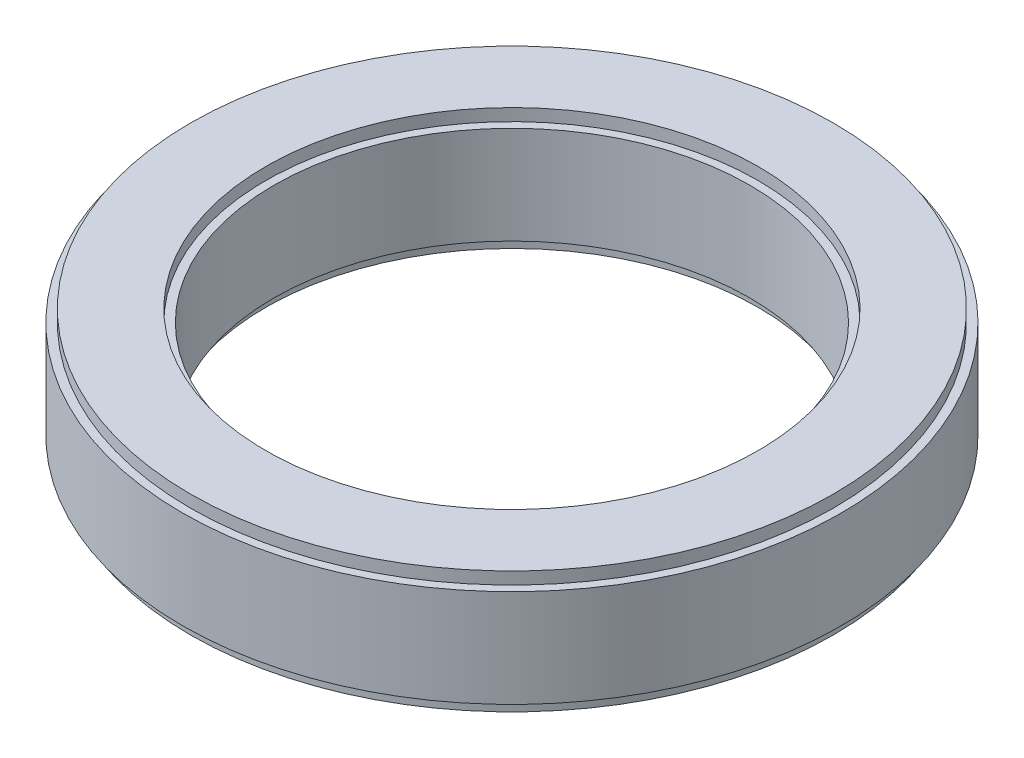
ISO-10303-21;
HEADER;
FILE_DESCRIPTION(('STEP AP214'),'2;1');
FILE_NAME('part.step','',(''),(''),'','','');
FILE_SCHEMA(('AUTOMOTIVE_DESIGN { 1 0 10303 214 1 1 1 1 }'));
ENDSEC;
DATA;
#1=APPLICATION_CONTEXT('core data for automotive mechanical design processes');
#2=APPLICATION_PROTOCOL_DEFINITION('international standard','automotive_design',2000,#1);
#3=PRODUCT_CONTEXT('',#1,'mechanical');
#4=PRODUCT('Part','Part','',(#3));
#5=PRODUCT_RELATED_PRODUCT_CATEGORY('part','',(#4));
#6=PRODUCT_DEFINITION_FORMATION('','',#4);
#7=PRODUCT_DEFINITION_CONTEXT('part definition',#1,'design');
#8=PRODUCT_DEFINITION('design','',#6,#7);
#9=PRODUCT_DEFINITION_SHAPE('','',#8);
#10=(LENGTH_UNIT() NAMED_UNIT(*) SI_UNIT(.MILLI.,.METRE.));
#11=(NAMED_UNIT(*) PLANE_ANGLE_UNIT() SI_UNIT($,.RADIAN.));
#12=(NAMED_UNIT(*) SI_UNIT($,.STERADIAN.) SOLID_ANGLE_UNIT());
#13=UNCERTAINTY_MEASURE_WITH_UNIT(LENGTH_MEASURE(1.E-05),#10,'distance_accuracy_value','');
#14=(GEOMETRIC_REPRESENTATION_CONTEXT(3) GLOBAL_UNCERTAINTY_ASSIGNED_CONTEXT((#13)) GLOBAL_UNIT_ASSIGNED_CONTEXT((#10,
#11,#12)) REPRESENTATION_CONTEXT('',''));
#15=CARTESIAN_POINT('',(0.,0.,0.));
#16=DIRECTION('',(0.,0.,1.));
#17=DIRECTION('',(1.,0.,0.));
#18=AXIS2_PLACEMENT_3D('',#15,#16,#17);
#19=CARTESIAN_POINT('',(-40.5,-6.,0.));
#20=DIRECTION('',(0.,-1.,0.));
#21=DIRECTION('',(0.,0.,-1.));
#22=AXIS2_PLACEMENT_3D('',#19,#20,#21);
#23=PLANE('',#22);
#24=CARTESIAN_POINT('',(0.,-6.,0.));
#25=DIRECTION('',(0.,1.,0.));
#26=DIRECTION('',(0.,0.,1.));
#27=AXIS2_PLACEMENT_3D('',#24,#25,#26);
#28=CIRCLE('',#27,40.5);
#29=CARTESIAN_POINT('',(0.,-6.,40.5));
#30=VERTEX_POINT('',#29);
#31=EDGE_CURVE('E10',#30,#30,#28,.T.);
#32=ORIENTED_EDGE('',*,*,#31,.F.);
#33=EDGE_LOOP('',(#32));
#34=FACE_BOUND('',#33,.T.);
#35=CARTESIAN_POINT('',(0.,-6.,0.));
#36=DIRECTION('',(0.,-1.,0.));
#37=DIRECTION('',(0.,0.,-1.));
#38=AXIS2_PLACEMENT_3D('',#35,#36,#37);
#39=CIRCLE('',#38,39.5);
#40=CARTESIAN_POINT('',(0.,-6.,-39.5));
#41=VERTEX_POINT('',#40);
#42=EDGE_CURVE('E65',#41,#41,#39,.F.);
#43=ORIENTED_EDGE('',*,*,#42,.T.);
#44=EDGE_LOOP('',(#43));
#45=FACE_BOUND('',#44,.T.);
#46=ADVANCED_FACE('F31',(#34,#45),#23,.T.);
#47=CARTESIAN_POINT('',(-40.5,6.,0.));
#48=DIRECTION('',(0.,1.,0.));
#49=DIRECTION('',(0.,0.,1.));
#50=AXIS2_PLACEMENT_3D('',#47,#48,#49);
#51=PLANE('',#50);
#52=CARTESIAN_POINT('',(0.,6.,0.));
#53=DIRECTION('',(0.,1.,0.));
#54=DIRECTION('',(0.,0.,1.));
#55=AXIS2_PLACEMENT_3D('',#52,#53,#54);
#56=CIRCLE('',#55,40.5);
#57=CARTESIAN_POINT('',(0.,6.,40.5));
#58=VERTEX_POINT('',#57);
#59=EDGE_CURVE('E68',#58,#58,#56,.T.);
#60=ORIENTED_EDGE('',*,*,#59,.T.);
#61=EDGE_LOOP('',(#60));
#62=FACE_BOUND('',#61,.T.);
#63=CARTESIAN_POINT('',(0.,6.,0.));
#64=DIRECTION('',(0.,1.,0.));
#65=DIRECTION('',(0.,0.,1.));
#66=AXIS2_PLACEMENT_3D('',#63,#64,#65);
#67=CIRCLE('',#66,39.5);
#68=CARTESIAN_POINT('',(0.,6.,39.5));
#69=VERTEX_POINT('',#68);
#70=EDGE_CURVE('E35',#69,#69,#67,.F.);
#71=ORIENTED_EDGE('',*,*,#70,.T.);
#72=EDGE_LOOP('',(#71));
#73=FACE_BOUND('',#72,.T.);
#74=ADVANCED_FACE('F79',(#62,#73),#51,.T.);
#75=CARTESIAN_POINT('',(0.,0.,0.));
#76=DIRECTION('',(0.,1.,0.));
#77=DIRECTION('',(0.,0.,1.));
#78=AXIS2_PLACEMENT_3D('',#75,#76,#77);
#79=CYLINDRICAL_SURFACE('',#78,40.5);
#80=ORIENTED_EDGE('',*,*,#31,.T.);
#81=EDGE_LOOP('',(#80));
#82=FACE_BOUND('',#81,.T.);
#83=ORIENTED_EDGE('',*,*,#59,.F.);
#84=EDGE_LOOP('',(#83));
#85=FACE_BOUND('',#84,.T.);
#86=ADVANCED_FACE('F33',(#82,#85),#79,.T.);
#87=CARTESIAN_POINT('',(0.,0.,0.));
#88=DIRECTION('',(0.,-1.,0.));
#89=DIRECTION('',(0.,0.,-1.));
#90=AXIS2_PLACEMENT_3D('',#87,#88,#89);
#91=CYLINDRICAL_SURFACE('',#90,39.5);
#92=ORIENTED_EDGE('',*,*,#70,.F.);
#93=EDGE_LOOP('',(#92));
#94=FACE_BOUND('',#93,.T.);
#95=CARTESIAN_POINT('',(0.,7.5,0.));
#96=DIRECTION('',(0.,-1.,0.));
#97=DIRECTION('',(0.,0.,-1.));
#98=AXIS2_PLACEMENT_3D('',#95,#96,#97);
#99=CIRCLE('',#98,39.5);
#100=CARTESIAN_POINT('',(0.,7.5,-39.5));
#101=VERTEX_POINT('',#100);
#102=EDGE_CURVE('E129',#101,#101,#99,.T.);
#103=ORIENTED_EDGE('',*,*,#102,.T.);
#104=EDGE_LOOP('',(#103));
#105=FACE_BOUND('',#104,.T.);
#106=ADVANCED_FACE('F116',(#94,#105),#91,.T.);
#107=CARTESIAN_POINT('',(-39.5,7.5,0.));
#108=DIRECTION('',(0.,-1.,0.));
#109=DIRECTION('',(0.,0.,-1.));
#110=AXIS2_PLACEMENT_3D('',#107,#108,#109);
#111=PLANE('',#110);
#112=ORIENTED_EDGE('',*,*,#102,.F.);
#113=EDGE_LOOP('',(#112));
#114=FACE_BOUND('',#113,.T.);
#115=CARTESIAN_POINT('',(0.,7.5,0.));
#116=DIRECTION('',(0.,-1.,0.));
#117=DIRECTION('',(0.,0.,-1.));
#118=AXIS2_PLACEMENT_3D('',#115,#116,#117);
#119=CIRCLE('',#118,30.25);
#120=CARTESIAN_POINT('',(0.,7.5,-30.25));
#121=VERTEX_POINT('',#120);
#122=EDGE_CURVE('E61',#121,#121,#119,.T.);
#123=ORIENTED_EDGE('',*,*,#122,.T.);
#124=EDGE_LOOP('',(#123));
#125=FACE_BOUND('',#124,.T.);
#126=ADVANCED_FACE('F119',(#114,#125),#111,.F.);
#127=CARTESIAN_POINT('',(0.,0.,0.));
#128=DIRECTION('',(0.,-1.,0.));
#129=DIRECTION('',(0.,0.,-1.));
#130=AXIS2_PLACEMENT_3D('',#127,#128,#129);
#131=CYLINDRICAL_SURFACE('',#130,30.25);
#132=CARTESIAN_POINT('',(0.,6.,0.));
#133=DIRECTION('',(0.,1.,0.));
#134=DIRECTION('',(0.,0.,1.));
#135=AXIS2_PLACEMENT_3D('',#132,#133,#134);
#136=CIRCLE('',#135,30.25);
#137=CARTESIAN_POINT('',(0.,6.,30.25));
#138=VERTEX_POINT('',#137);
#139=EDGE_CURVE('E47',#138,#138,#136,.T.);
#140=ORIENTED_EDGE('',*,*,#139,.F.);
#141=EDGE_LOOP('',(#140));
#142=FACE_BOUND('',#141,.T.);
#143=ORIENTED_EDGE('',*,*,#122,.F.);
#144=EDGE_LOOP('',(#143));
#145=FACE_BOUND('',#144,.T.);
#146=ADVANCED_FACE('F110',(#142,#145),#131,.F.);
#147=ORIENTED_EDGE('',*,*,#42,.F.);
#148=EDGE_LOOP('',(#147));
#149=FACE_BOUND('',#148,.T.);
#150=CARTESIAN_POINT('',(0.,-7.5,0.));
#151=DIRECTION('',(0.,-1.,0.));
#152=DIRECTION('',(0.,0.,-1.));
#153=AXIS2_PLACEMENT_3D('',#150,#151,#152);
#154=CIRCLE('',#153,39.5);
#155=CARTESIAN_POINT('',(0.,-7.5,-39.5));
#156=VERTEX_POINT('',#155);
#157=EDGE_CURVE('E50',#156,#156,#154,.T.);
#158=ORIENTED_EDGE('',*,*,#157,.F.);
#159=EDGE_LOOP('',(#158));
#160=FACE_BOUND('',#159,.T.);
#161=ADVANCED_FACE('F108',(#149,#160),#91,.T.);
#162=CARTESIAN_POINT('',(0.,-6.,0.));
#163=DIRECTION('',(0.,-1.,0.));
#164=DIRECTION('',(0.,0.,-1.));
#165=AXIS2_PLACEMENT_3D('',#162,#163,#164);
#166=CIRCLE('',#165,30.25);
#167=CARTESIAN_POINT('',(0.,-6.,-30.25));
#168=VERTEX_POINT('',#167);
#169=EDGE_CURVE('E49',#168,#168,#166,.T.);
#170=ORIENTED_EDGE('',*,*,#169,.F.);
#171=EDGE_LOOP('',(#170));
#172=FACE_BOUND('',#171,.T.);
#173=CARTESIAN_POINT('',(0.,-7.5,0.));
#174=DIRECTION('',(0.,-1.,0.));
#175=DIRECTION('',(0.,0.,-1.));
#176=AXIS2_PLACEMENT_3D('',#173,#174,#175);
#177=CIRCLE('',#176,30.25);
#178=CARTESIAN_POINT('',(0.,-7.5,-30.25));
#179=VERTEX_POINT('',#178);
#180=EDGE_CURVE('E56',#179,#179,#177,.T.);
#181=ORIENTED_EDGE('',*,*,#180,.T.);
#182=EDGE_LOOP('',(#181));
#183=FACE_BOUND('',#182,.T.);
#184=ADVANCED_FACE('F99',(#172,#183),#131,.F.);
#185=CARTESIAN_POINT('',(-39.5,-7.5,0.));
#186=DIRECTION('',(0.,1.,0.));
#187=DIRECTION('',(0.,0.,1.));
#188=AXIS2_PLACEMENT_3D('',#185,#186,#187);
#189=PLANE('',#188);
#190=ORIENTED_EDGE('',*,*,#180,.F.);
#191=EDGE_LOOP('',(#190));
#192=FACE_BOUND('',#191,.T.);
#193=ORIENTED_EDGE('',*,*,#157,.T.);
#194=EDGE_LOOP('',(#193));
#195=FACE_BOUND('',#194,.T.);
#196=ADVANCED_FACE('F94',(#192,#195),#189,.F.);
#197=CARTESIAN_POINT('',(0.,-6.,0.));
#198=DIRECTION('',(0.,1.,0.));
#199=DIRECTION('',(0.,0.,1.));
#200=AXIS2_PLACEMENT_3D('',#197,#198,#199);
#201=CIRCLE('',#200,29.25);
#202=CARTESIAN_POINT('',(0.,-6.,29.25));
#203=VERTEX_POINT('',#202);
#204=EDGE_CURVE('E39',#203,#203,#201,.T.);
#205=ORIENTED_EDGE('',*,*,#204,.T.);
#206=EDGE_LOOP('',(#205));
#207=FACE_BOUND('',#206,.T.);
#208=ORIENTED_EDGE('',*,*,#169,.T.);
#209=EDGE_LOOP('',(#208));
#210=FACE_BOUND('',#209,.T.);
#211=ADVANCED_FACE('F83',(#207,#210),#23,.T.);
#212=CARTESIAN_POINT('',(0.,0.,0.));
#213=DIRECTION('',(0.,1.,0.));
#214=DIRECTION('',(0.,0.,1.));
#215=AXIS2_PLACEMENT_3D('',#212,#213,#214);
#216=CYLINDRICAL_SURFACE('',#215,29.25);
#217=CARTESIAN_POINT('',(0.,6.,0.));
#218=DIRECTION('',(0.,1.,0.));
#219=DIRECTION('',(0.,0.,1.));
#220=AXIS2_PLACEMENT_3D('',#217,#218,#219);
#221=CIRCLE('',#220,29.25);
#222=CARTESIAN_POINT('',(0.,6.,29.25));
#223=VERTEX_POINT('',#222);
#224=EDGE_CURVE('E44',#223,#223,#221,.T.);
#225=ORIENTED_EDGE('',*,*,#224,.T.);
#226=EDGE_LOOP('',(#225));
#227=FACE_BOUND('',#226,.T.);
#228=ORIENTED_EDGE('',*,*,#204,.F.);
#229=EDGE_LOOP('',(#228));
#230=FACE_BOUND('',#229,.T.);
#231=ADVANCED_FACE('F73',(#227,#230),#216,.F.);
#232=ORIENTED_EDGE('',*,*,#224,.F.);
#233=EDGE_LOOP('',(#232));
#234=FACE_BOUND('',#233,.T.);
#235=ORIENTED_EDGE('',*,*,#139,.T.);
#236=EDGE_LOOP('',(#235));
#237=FACE_BOUND('',#236,.T.);
#238=ADVANCED_FACE('F76',(#234,#237),#51,.T.);
#239=CLOSED_SHELL('',(#46,#74,#86,#106,#126,#146,#161,#184,#196,#211,#231,#238));
#240=MANIFOLD_SOLID_BREP('B2',#239);
#241=ADVANCED_BREP_SHAPE_REPRESENTATION('',(#18,#240),#14);
#242=SHAPE_DEFINITION_REPRESENTATION(#9,#241);
ENDSEC;
END-ISO-10303-21;
